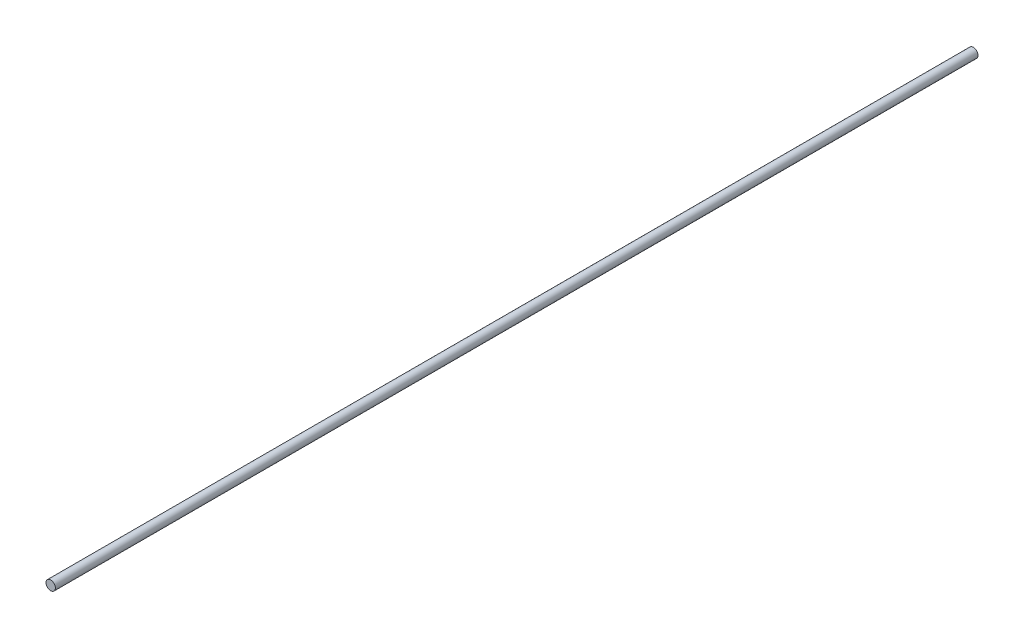
ISO-10303-21;
HEADER;
FILE_DESCRIPTION(('STEP AP214'),'2;1');
FILE_NAME('part.step','',(''),(''),'','','');
FILE_SCHEMA(('AUTOMOTIVE_DESIGN { 1 0 10303 214 1 1 1 1 }'));
ENDSEC;
DATA;
#1=APPLICATION_CONTEXT('core data for automotive mechanical design processes');
#2=APPLICATION_PROTOCOL_DEFINITION('international standard','automotive_design',2000,#1);
#3=PRODUCT_CONTEXT('',#1,'mechanical');
#4=PRODUCT('Part','Part','',(#3));
#5=PRODUCT_RELATED_PRODUCT_CATEGORY('part','',(#4));
#6=PRODUCT_DEFINITION_FORMATION('','',#4);
#7=PRODUCT_DEFINITION_CONTEXT('part definition',#1,'design');
#8=PRODUCT_DEFINITION('design','',#6,#7);
#9=PRODUCT_DEFINITION_SHAPE('','',#8);
#10=(LENGTH_UNIT() NAMED_UNIT(*) SI_UNIT(.MILLI.,.METRE.));
#11=(NAMED_UNIT(*) PLANE_ANGLE_UNIT() SI_UNIT($,.RADIAN.));
#12=(NAMED_UNIT(*) SI_UNIT($,.STERADIAN.) SOLID_ANGLE_UNIT());
#13=UNCERTAINTY_MEASURE_WITH_UNIT(LENGTH_MEASURE(1.E-05),#10,'distance_accuracy_value','');
#14=(GEOMETRIC_REPRESENTATION_CONTEXT(3) GLOBAL_UNCERTAINTY_ASSIGNED_CONTEXT((#13)) GLOBAL_UNIT_ASSIGNED_CONTEXT((#10,
#11,#12)) REPRESENTATION_CONTEXT('',''));
#15=CARTESIAN_POINT('',(0.,0.,0.));
#16=DIRECTION('',(0.,0.,1.));
#17=DIRECTION('',(1.,0.,0.));
#18=AXIS2_PLACEMENT_3D('',#15,#16,#17);
#19=CARTESIAN_POINT('',(0.,0.,2254.25));
#20=DIRECTION('',(0.,0.,-1.));
#21=DIRECTION('',(-1.,0.,0.));
#22=AXIS2_PLACEMENT_3D('',#19,#20,#21);
#23=CYLINDRICAL_SURFACE('',#22,7.9375);
#24=CARTESIAN_POINT('',(0.,0.,438.15));
#25=DIRECTION('',(0.,0.,-1.));
#26=DIRECTION('',(-1.,0.,0.));
#27=AXIS2_PLACEMENT_3D('',#24,#25,#26);
#28=CIRCLE('',#27,7.9375);
#29=CARTESIAN_POINT('',(-7.9375,0.,438.15));
#30=VERTEX_POINT('',#29);
#31=EDGE_CURVE('E10',#30,#30,#28,.T.);
#32=ORIENTED_EDGE('',*,*,#31,.F.);
#33=EDGE_LOOP('',(#32));
#34=FACE_BOUND('',#33,.T.);
#35=CARTESIAN_POINT('',(0.,0.,2000.25));
#36=DIRECTION('',(0.,0.,1.));
#37=DIRECTION('',(1.,0.,0.));
#38=AXIS2_PLACEMENT_3D('',#35,#36,#37);
#39=CIRCLE('',#38,7.9375);
#40=CARTESIAN_POINT('',(7.9375,0.,2000.25));
#41=VERTEX_POINT('',#40);
#42=EDGE_CURVE('E48',#41,#41,#39,.T.);
#43=ORIENTED_EDGE('',*,*,#42,.F.);
#44=EDGE_LOOP('',(#43));
#45=FACE_BOUND('',#44,.T.);
#46=ADVANCED_FACE('F41',(#34,#45),#23,.T.);
#47=CARTESIAN_POINT('',(0.,0.,438.15));
#48=DIRECTION('',(0.,0.,-1.));
#49=DIRECTION('',(-1.,0.,0.));
#50=AXIS2_PLACEMENT_3D('',#47,#48,#49);
#51=PLANE('',#50);
#52=ORIENTED_EDGE('',*,*,#31,.T.);
#53=EDGE_LOOP('',(#52));
#54=FACE_BOUND('',#53,.T.);
#55=ADVANCED_FACE('F58',(#54),#51,.T.);
#56=CARTESIAN_POINT('',(0.,0.,2000.25));
#57=DIRECTION('',(0.,0.,1.));
#58=DIRECTION('',(1.,0.,0.));
#59=AXIS2_PLACEMENT_3D('',#56,#57,#58);
#60=PLANE('',#59);
#61=ORIENTED_EDGE('',*,*,#42,.T.);
#62=EDGE_LOOP('',(#61));
#63=FACE_BOUND('',#62,.T.);
#64=ADVANCED_FACE('F55',(#63),#60,.T.);
#65=CLOSED_SHELL('',(#46,#55,#64));
#66=MANIFOLD_SOLID_BREP('B2',#65);
#67=ADVANCED_BREP_SHAPE_REPRESENTATION('',(#18,#66),#14);
#68=SHAPE_DEFINITION_REPRESENTATION(#9,#67);
ENDSEC;
END-ISO-10303-21;
